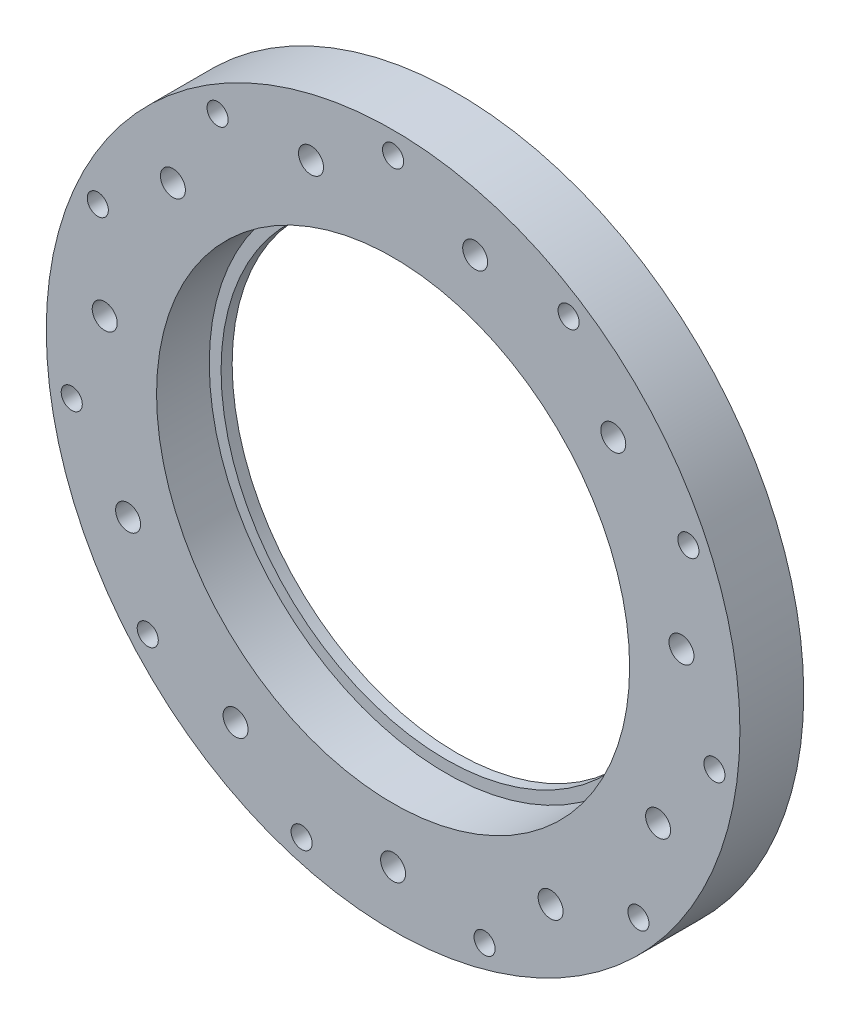
ISO-10303-21;
HEADER;
FILE_DESCRIPTION(('STEP AP214'),'2;1');
FILE_NAME('part.step','',(''),(''),'','','');
FILE_SCHEMA(('AUTOMOTIVE_DESIGN { 1 0 10303 214 1 1 1 1 }'));
ENDSEC;
DATA;
#1=APPLICATION_CONTEXT('core data for automotive mechanical design processes');
#2=APPLICATION_PROTOCOL_DEFINITION('international standard','automotive_design',2000,#1);
#3=PRODUCT_CONTEXT('',#1,'mechanical');
#4=PRODUCT('Part','Part','',(#3));
#5=PRODUCT_RELATED_PRODUCT_CATEGORY('part','',(#4));
#6=PRODUCT_DEFINITION_FORMATION('','',#4);
#7=PRODUCT_DEFINITION_CONTEXT('part definition',#1,'design');
#8=PRODUCT_DEFINITION('design','',#6,#7);
#9=PRODUCT_DEFINITION_SHAPE('','',#8);
#10=(LENGTH_UNIT() NAMED_UNIT(*) SI_UNIT(.MILLI.,.METRE.));
#11=(NAMED_UNIT(*) PLANE_ANGLE_UNIT() SI_UNIT($,.RADIAN.));
#12=(NAMED_UNIT(*) SI_UNIT($,.STERADIAN.) SOLID_ANGLE_UNIT());
#13=UNCERTAINTY_MEASURE_WITH_UNIT(LENGTH_MEASURE(1.E-05),#10,'distance_accuracy_value','');
#14=(GEOMETRIC_REPRESENTATION_CONTEXT(3) GLOBAL_UNCERTAINTY_ASSIGNED_CONTEXT((#13)) GLOBAL_UNIT_ASSIGNED_CONTEXT((#10,
#11,#12)) REPRESENTATION_CONTEXT('',''));
#15=CARTESIAN_POINT('',(0.,0.,0.));
#16=DIRECTION('',(0.,0.,1.));
#17=DIRECTION('',(1.,0.,0.));
#18=AXIS2_PLACEMENT_3D('',#15,#16,#17);
#19=CARTESIAN_POINT('',(0.,0.,11.5));
#20=DIRECTION('',(0.,0.,-1.));
#21=DIRECTION('',(-1.,0.,0.));
#22=AXIS2_PLACEMENT_3D('',#19,#20,#21);
#23=CYLINDRICAL_SURFACE('',#22,40.5);
#24=CARTESIAN_POINT('',(0.,0.,0.));
#25=DIRECTION('',(0.,0.,1.));
#26=DIRECTION('',(1.,0.,0.));
#27=AXIS2_PLACEMENT_3D('',#24,#25,#26);
#28=CIRCLE('',#27,40.5);
#29=CARTESIAN_POINT('',(40.5,0.,0.));
#30=VERTEX_POINT('',#29);
#31=EDGE_CURVE('E52',#30,#30,#28,.T.);
#32=ORIENTED_EDGE('',*,*,#31,.F.);
#33=EDGE_LOOP('',(#32));
#34=FACE_BOUND('',#33,.T.);
#35=CARTESIAN_POINT('',(0.,0.,2.));
#36=DIRECTION('',(0.,0.,1.));
#37=DIRECTION('',(1.,0.,0.));
#38=AXIS2_PLACEMENT_3D('',#35,#36,#37);
#39=CIRCLE('',#38,40.5);
#40=CARTESIAN_POINT('',(40.5,0.,2.));
#41=VERTEX_POINT('',#40);
#42=EDGE_CURVE('E41',#41,#41,#39,.T.);
#43=ORIENTED_EDGE('',*,*,#42,.T.);
#44=EDGE_LOOP('',(#43));
#45=FACE_BOUND('',#44,.T.);
#46=ADVANCED_FACE('F37',(#34,#45),#23,.F.);
#47=CARTESIAN_POINT('',(0.,0.,11.5));
#48=DIRECTION('',(0.,0.,1.));
#49=DIRECTION('',(1.,0.,0.));
#50=AXIS2_PLACEMENT_3D('',#47,#48,#49);
#51=PLANE('',#50);
#52=CARTESIAN_POINT('',(0.,0.,11.5));
#53=DIRECTION('',(0.,0.,1.));
#54=DIRECTION('',(1.,0.,0.));
#55=AXIS2_PLACEMENT_3D('',#52,#53,#54);
#56=CIRCLE('',#55,42.625);
#57=CARTESIAN_POINT('',(42.625,0.,11.5));
#58=VERTEX_POINT('',#57);
#59=EDGE_CURVE('E233',#58,#58,#56,.T.);
#60=ORIENTED_EDGE('',*,*,#59,.F.);
#61=EDGE_LOOP('',(#60));
#62=FACE_BOUND('',#61,.T.);
#63=CARTESIAN_POINT('',(16.481354575223,-56.1303389564483,11.5));
#64=DIRECTION('',(0.,0.,1.));
#65=DIRECTION('',(1.,0.,0.));
#66=AXIS2_PLACEMENT_3D('',#63,#64,#65);
#67=CIRCLE('',#66,1.9);
#68=CARTESIAN_POINT('',(18.381354575223,-56.1303389564483,11.5));
#69=VERTEX_POINT('',#68);
#70=EDGE_CURVE('E214',#69,#69,#67,.T.);
#71=ORIENTED_EDGE('',*,*,#70,.F.);
#72=EDGE_LOOP('',(#71));
#73=FACE_BOUND('',#72,.T.);
#74=CARTESIAN_POINT('',(57.9045543500346,-8.32541803898774,11.5));
#75=DIRECTION('',(0.,0.,1.));
#76=DIRECTION('',(1.,0.,0.));
#77=AXIS2_PLACEMENT_3D('',#74,#75,#76);
#78=CIRCLE('',#77,1.89999999999999);
#79=CARTESIAN_POINT('',(59.8045543500346,-8.32541803898774,11.5));
#80=VERTEX_POINT('',#79);
#81=EDGE_CURVE('E198',#80,#80,#78,.T.);
#82=ORIENTED_EDGE('',*,*,#81,.F.);
#83=EDGE_LOOP('',(#82));
#84=FACE_BOUND('',#83,.T.);
#85=CARTESIAN_POINT('',(31.6274878211535,49.2133316706235,11.5));
#86=DIRECTION('',(0.,0.,1.));
#87=DIRECTION('',(1.,0.,0.));
#88=AXIS2_PLACEMENT_3D('',#85,#86,#87);
#89=CIRCLE('',#88,1.90000000000001);
#90=CARTESIAN_POINT('',(33.5274878211535,49.2133316706235,11.5));
#91=VERTEX_POINT('',#90);
#92=EDGE_CURVE('E182',#91,#91,#89,.T.);
#93=ORIENTED_EDGE('',*,*,#92,.F.);
#94=EDGE_LOOP('',(#93));
#95=FACE_BOUND('',#94,.T.);
#96=CARTESIAN_POINT('',(-31.6274878211516,49.2133316706247,11.5));
#97=DIRECTION('',(0.,0.,1.));
#98=DIRECTION('',(1.,0.,0.));
#99=AXIS2_PLACEMENT_3D('',#96,#97,#98);
#100=CIRCLE('',#99,1.9);
#101=CARTESIAN_POINT('',(-29.7274878211516,49.2133316706247,11.5));
#102=VERTEX_POINT('',#101);
#103=EDGE_CURVE('E166',#102,#102,#100,.T.);
#104=ORIENTED_EDGE('',*,*,#103,.F.);
#105=EDGE_LOOP('',(#104));
#106=FACE_BOUND('',#105,.T.);
#107=CARTESIAN_POINT('',(-57.9045543500347,-8.3254180389863,11.5));
#108=DIRECTION('',(0.,0.,1.));
#109=DIRECTION('',(1.,0.,0.));
#110=AXIS2_PLACEMENT_3D('',#107,#108,#109);
#111=CIRCLE('',#110,1.9);
#112=CARTESIAN_POINT('',(-56.0045543500347,-8.3254180389863,11.5));
#113=VERTEX_POINT('',#112);
#114=EDGE_CURVE('E150',#113,#113,#111,.T.);
#115=ORIENTED_EDGE('',*,*,#114,.F.);
#116=EDGE_LOOP('',(#115));
#117=FACE_BOUND('',#116,.T.);
#118=CARTESIAN_POINT('',(28.3836429164183,-44.1658104736374,11.5));
#119=DIRECTION('',(0.,0.,1.));
#120=DIRECTION('',(1.,0.,0.));
#121=AXIS2_PLACEMENT_3D('',#118,#119,#120);
#122=CIRCLE('',#121,2.25000000000001);
#123=CARTESIAN_POINT('',(30.6336429164183,-44.1658104736374,11.5));
#124=VERTEX_POINT('',#123);
#125=EDGE_CURVE('E134',#124,#124,#122,.T.);
#126=ORIENTED_EDGE('',*,*,#125,.F.);
#127=EDGE_LOOP('',(#126));
#128=FACE_BOUND('',#127,.T.);
#129=CARTESIAN_POINT('',(51.965625698749,7.47152900934691,11.5));
#130=DIRECTION('',(0.,0.,1.));
#131=DIRECTION('',(1.,0.,0.));
#132=AXIS2_PLACEMENT_3D('',#129,#130,#131);
#133=CIRCLE('',#132,2.25);
#134=CARTESIAN_POINT('',(54.2156256987491,7.47152900934691,11.5));
#135=VERTEX_POINT('',#134);
#136=EDGE_CURVE('E118',#135,#135,#133,.T.);
#137=ORIENTED_EDGE('',*,*,#136,.F.);
#138=EDGE_LOOP('',(#137));
#139=FACE_BOUND('',#138,.T.);
#140=CARTESIAN_POINT('',(14.7909592341755,50.373381114761,11.5));
#141=DIRECTION('',(0.,0.,1.));
#142=DIRECTION('',(1.,0.,0.));
#143=AXIS2_PLACEMENT_3D('',#140,#141,#142);
#144=CIRCLE('',#143,2.25);
#145=CARTESIAN_POINT('',(17.0409592341755,50.373381114761,11.5));
#146=VERTEX_POINT('',#145);
#147=EDGE_CURVE('E102',#146,#146,#144,.T.);
#148=ORIENTED_EDGE('',*,*,#147,.F.);
#149=EDGE_LOOP('',(#148));
#150=FACE_BOUND('',#149,.T.);
#151=CARTESIAN_POINT('',(-39.6768526535979,34.3801885321282,11.5));
#152=DIRECTION('',(0.,0.,1.));
#153=DIRECTION('',(1.,0.,0.));
#154=AXIS2_PLACEMENT_3D('',#151,#152,#153);
#155=CIRCLE('',#154,2.25);
#156=CARTESIAN_POINT('',(-37.4268526535979,34.3801885321282,11.5));
#157=VERTEX_POINT('',#156);
#158=EDGE_CURVE('E86',#157,#157,#155,.T.);
#159=ORIENTED_EDGE('',*,*,#158,.F.);
#160=EDGE_LOOP('',(#159));
#161=FACE_BOUND('',#160,.T.);
#162=CARTESIAN_POINT('',(-47.7556797561126,-21.8092881825982,11.5));
#163=DIRECTION('',(0.,0.,1.));
#164=DIRECTION('',(1.,0.,0.));
#165=AXIS2_PLACEMENT_3D('',#162,#163,#164);
#166=CIRCLE('',#165,2.25);
#167=CARTESIAN_POINT('',(-45.5056797561126,-21.8092881825982,11.5));
#168=VERTEX_POINT('',#167);
#169=EDGE_CURVE('E70',#168,#168,#166,.T.);
#170=ORIENTED_EDGE('',*,*,#169,.F.);
#171=EDGE_LOOP('',(#170));
#172=FACE_BOUND('',#171,.T.);
#173=CARTESIAN_POINT('',(0.,-52.5,11.5));
#174=DIRECTION('',(0.,0.,1.));
#175=DIRECTION('',(1.,0.,0.));
#176=AXIS2_PLACEMENT_3D('',#173,#174,#175);
#177=CIRCLE('',#176,2.25);
#178=CARTESIAN_POINT('',(2.25,-52.5,11.5));
#179=VERTEX_POINT('',#178);
#180=EDGE_CURVE('E57',#179,#179,#177,.T.);
#181=ORIENTED_EDGE('',*,*,#180,.F.);
#182=EDGE_LOOP('',(#181));
#183=FACE_BOUND('',#182,.T.);
#184=CARTESIAN_POINT('',(0.,0.,11.5));
#185=DIRECTION('',(0.,0.,1.));
#186=DIRECTION('',(1.,0.,0.));
#187=AXIS2_PLACEMENT_3D('',#184,#185,#186);
#188=CIRCLE('',#187,62.5);
#189=CARTESIAN_POINT('',(62.5,0.,11.5));
#190=VERTEX_POINT('',#189);
#191=EDGE_CURVE('E10',#190,#190,#188,.T.);
#192=ORIENTED_EDGE('',*,*,#191,.T.);
#193=EDGE_LOOP('',(#192));
#194=FACE_BOUND('',#193,.T.);
#195=CARTESIAN_POINT('',(-28.3836429164196,-44.1658104736366,11.5));
#196=DIRECTION('',(0.,0.,1.));
#197=DIRECTION('',(1.,0.,0.));
#198=AXIS2_PLACEMENT_3D('',#195,#196,#197);
#199=CIRCLE('',#198,2.25);
#200=CARTESIAN_POINT('',(-26.1336429164196,-44.1658104736366,11.5));
#201=VERTEX_POINT('',#200);
#202=EDGE_CURVE('E62',#201,#201,#199,.T.);
#203=ORIENTED_EDGE('',*,*,#202,.F.);
#204=EDGE_LOOP('',(#203));
#205=FACE_BOUND('',#204,.T.);
#206=CARTESIAN_POINT('',(-51.9656256987488,7.4715290093484,11.5));
#207=DIRECTION('',(0.,0.,1.));
#208=DIRECTION('',(1.,0.,0.));
#209=AXIS2_PLACEMENT_3D('',#206,#207,#208);
#210=CIRCLE('',#209,2.25);
#211=CARTESIAN_POINT('',(-49.7156256987488,7.4715290093484,11.5));
#212=VERTEX_POINT('',#211);
#213=EDGE_CURVE('E78',#212,#212,#210,.T.);
#214=ORIENTED_EDGE('',*,*,#213,.F.);
#215=EDGE_LOOP('',(#214));
#216=FACE_BOUND('',#215,.T.);
#217=CARTESIAN_POINT('',(-14.790959234174,50.3733811147614,11.5));
#218=DIRECTION('',(0.,0.,1.));
#219=DIRECTION('',(1.,0.,0.));
#220=AXIS2_PLACEMENT_3D('',#217,#218,#219);
#221=CIRCLE('',#220,2.25);
#222=CARTESIAN_POINT('',(-12.540959234174,50.3733811147614,11.5));
#223=VERTEX_POINT('',#222);
#224=EDGE_CURVE('E94',#223,#223,#221,.T.);
#225=ORIENTED_EDGE('',*,*,#224,.F.);
#226=EDGE_LOOP('',(#225));
#227=FACE_BOUND('',#226,.T.);
#228=CARTESIAN_POINT('',(39.6768526535989,34.3801885321271,11.5));
#229=DIRECTION('',(0.,0.,1.));
#230=DIRECTION('',(1.,0.,0.));
#231=AXIS2_PLACEMENT_3D('',#228,#229,#230);
#232=CIRCLE('',#231,2.25);
#233=CARTESIAN_POINT('',(41.9268526535989,34.3801885321271,11.5));
#234=VERTEX_POINT('',#233);
#235=EDGE_CURVE('E110',#234,#234,#232,.T.);
#236=ORIENTED_EDGE('',*,*,#235,.F.);
#237=EDGE_LOOP('',(#236));
#238=FACE_BOUND('',#237,.T.);
#239=CARTESIAN_POINT('',(47.7556797561119,-21.8092881825996,11.5));
#240=DIRECTION('',(0.,0.,1.));
#241=DIRECTION('',(1.,0.,0.));
#242=AXIS2_PLACEMENT_3D('',#239,#240,#241);
#243=CIRCLE('',#242,2.25);
#244=CARTESIAN_POINT('',(50.0056797561119,-21.8092881825996,11.5));
#245=VERTEX_POINT('',#244);
#246=EDGE_CURVE('E126',#245,#245,#243,.T.);
#247=ORIENTED_EDGE('',*,*,#246,.F.);
#248=EDGE_LOOP('',(#247));
#249=FACE_BOUND('',#248,.T.);
#250=CARTESIAN_POINT('',(-44.2113500997241,-38.3093529357992,11.5));
#251=DIRECTION('',(0.,0.,1.));
#252=DIRECTION('',(1.,0.,0.));
#253=AXIS2_PLACEMENT_3D('',#250,#251,#252);
#254=CIRCLE('',#253,1.9);
#255=CARTESIAN_POINT('',(-42.3113500997241,-38.3093529357992,11.5));
#256=VERTEX_POINT('',#255);
#257=EDGE_CURVE('E142',#256,#256,#254,.T.);
#258=ORIENTED_EDGE('',*,*,#257,.F.);
#259=EDGE_LOOP('',(#258));
#260=FACE_BOUND('',#259,.T.);
#261=CARTESIAN_POINT('',(-53.2134717282389,24.3017782606113,11.5));
#262=DIRECTION('',(0.,0.,1.));
#263=DIRECTION('',(1.,0.,0.));
#264=AXIS2_PLACEMENT_3D('',#261,#262,#263);
#265=CIRCLE('',#264,1.9);
#266=CARTESIAN_POINT('',(-51.3134717282389,24.3017782606113,11.5));
#267=VERTEX_POINT('',#266);
#268=EDGE_CURVE('E158',#267,#267,#265,.T.);
#269=ORIENTED_EDGE('',*,*,#268,.F.);
#270=EDGE_LOOP('',(#269));
#271=FACE_BOUND('',#270,.T.);
#272=CARTESIAN_POINT('',(1.19522447494802E-12,58.5,11.5));
#273=DIRECTION('',(0.,0.,1.));
#274=DIRECTION('',(1.,0.,0.));
#275=AXIS2_PLACEMENT_3D('',#272,#273,#274);
#276=CIRCLE('',#275,1.9);
#277=CARTESIAN_POINT('',(1.90000000000119,58.5,11.5));
#278=VERTEX_POINT('',#277);
#279=EDGE_CURVE('E174',#278,#278,#276,.T.);
#280=ORIENTED_EDGE('',*,*,#279,.F.);
#281=EDGE_LOOP('',(#280));
#282=FACE_BOUND('',#281,.T.);
#283=CARTESIAN_POINT('',(53.2134717282399,24.3017782606092,11.5));
#284=DIRECTION('',(0.,0.,1.));
#285=DIRECTION('',(1.,0.,0.));
#286=AXIS2_PLACEMENT_3D('',#283,#284,#285);
#287=CIRCLE('',#286,1.9);
#288=CARTESIAN_POINT('',(55.1134717282399,24.3017782606092,11.5));
#289=VERTEX_POINT('',#288);
#290=EDGE_CURVE('E190',#289,#289,#287,.T.);
#291=ORIENTED_EDGE('',*,*,#290,.F.);
#292=EDGE_LOOP('',(#291));
#293=FACE_BOUND('',#292,.T.);
#294=CARTESIAN_POINT('',(44.2113500997238,-38.3093529357997,11.5));
#295=DIRECTION('',(0.,0.,1.));
#296=DIRECTION('',(1.,0.,0.));
#297=AXIS2_PLACEMENT_3D('',#294,#295,#296);
#298=CIRCLE('',#297,1.90000000000001);
#299=CARTESIAN_POINT('',(46.1113500997238,-38.3093529357997,11.5));
#300=VERTEX_POINT('',#299);
#301=EDGE_CURVE('E206',#300,#300,#298,.T.);
#302=ORIENTED_EDGE('',*,*,#301,.F.);
#303=EDGE_LOOP('',(#302));
#304=FACE_BOUND('',#303,.T.);
#305=CARTESIAN_POINT('',(-16.4813545752244,-56.1303389564479,11.5));
#306=DIRECTION('',(0.,0.,1.));
#307=DIRECTION('',(1.,0.,0.));
#308=AXIS2_PLACEMENT_3D('',#305,#306,#307);
#309=CIRCLE('',#308,1.89999999999999);
#310=CARTESIAN_POINT('',(-14.5813545752244,-56.1303389564479,11.5));
#311=VERTEX_POINT('',#310);
#312=EDGE_CURVE('E222',#311,#311,#309,.T.);
#313=ORIENTED_EDGE('',*,*,#312,.F.);
#314=EDGE_LOOP('',(#313));
#315=FACE_BOUND('',#314,.T.);
#316=ADVANCED_FACE('F258',(#62,#73,#84,#95,#106,#117,#128,#139,#150,#161,#172,#183,#194,#205,
#216,#227,#238,#249,#260,#271,#282,#293,#304,#315),#51,.T.);
#317=CARTESIAN_POINT('',(0.,0.,0.));
#318=DIRECTION('',(0.,0.,1.));
#319=DIRECTION('',(1.,0.,0.));
#320=AXIS2_PLACEMENT_3D('',#317,#318,#319);
#321=PLANE('',#320);
#322=CARTESIAN_POINT('',(0.,0.,0.));
#323=DIRECTION('',(0.,0.,1.));
#324=DIRECTION('',(1.,0.,0.));
#325=AXIS2_PLACEMENT_3D('',#322,#323,#324);
#326=CIRCLE('',#325,62.5);
#327=CARTESIAN_POINT('',(62.5,0.,0.));
#328=VERTEX_POINT('',#327);
#329=EDGE_CURVE('E46',#328,#328,#326,.T.);
#330=ORIENTED_EDGE('',*,*,#329,.F.);
#331=EDGE_LOOP('',(#330));
#332=FACE_BOUND('',#331,.T.);
#333=ORIENTED_EDGE('',*,*,#31,.T.);
#334=EDGE_LOOP('',(#333));
#335=FACE_BOUND('',#334,.T.);
#336=CARTESIAN_POINT('',(0.,-52.5,0.));
#337=DIRECTION('',(0.,0.,1.));
#338=DIRECTION('',(1.,0.,0.));
#339=AXIS2_PLACEMENT_3D('',#336,#337,#338);
#340=CIRCLE('',#339,2.25);
#341=CARTESIAN_POINT('',(2.25,-52.5,0.));
#342=VERTEX_POINT('',#341);
#343=EDGE_CURVE('E58',#342,#342,#340,.T.);
#344=ORIENTED_EDGE('',*,*,#343,.T.);
#345=EDGE_LOOP('',(#344));
#346=FACE_BOUND('',#345,.T.);
#347=CARTESIAN_POINT('',(-28.3836429164196,-44.1658104736366,0.));
#348=DIRECTION('',(0.,0.,1.));
#349=DIRECTION('',(1.,0.,0.));
#350=AXIS2_PLACEMENT_3D('',#347,#348,#349);
#351=CIRCLE('',#350,2.25);
#352=CARTESIAN_POINT('',(-26.1336429164196,-44.1658104736366,0.));
#353=VERTEX_POINT('',#352);
#354=EDGE_CURVE('E66',#353,#353,#351,.T.);
#355=ORIENTED_EDGE('',*,*,#354,.T.);
#356=EDGE_LOOP('',(#355));
#357=FACE_BOUND('',#356,.T.);
#358=CARTESIAN_POINT('',(-47.7556797561126,-21.8092881825982,0.));
#359=DIRECTION('',(0.,0.,1.));
#360=DIRECTION('',(1.,0.,0.));
#361=AXIS2_PLACEMENT_3D('',#358,#359,#360);
#362=CIRCLE('',#361,2.25);
#363=CARTESIAN_POINT('',(-45.5056797561126,-21.8092881825982,0.));
#364=VERTEX_POINT('',#363);
#365=EDGE_CURVE('E74',#364,#364,#362,.T.);
#366=ORIENTED_EDGE('',*,*,#365,.T.);
#367=EDGE_LOOP('',(#366));
#368=FACE_BOUND('',#367,.T.);
#369=CARTESIAN_POINT('',(-51.9656256987488,7.4715290093484,0.));
#370=DIRECTION('',(0.,0.,1.));
#371=DIRECTION('',(1.,0.,0.));
#372=AXIS2_PLACEMENT_3D('',#369,#370,#371);
#373=CIRCLE('',#372,2.25);
#374=CARTESIAN_POINT('',(-49.7156256987488,7.4715290093484,0.));
#375=VERTEX_POINT('',#374);
#376=EDGE_CURVE('E82',#375,#375,#373,.T.);
#377=ORIENTED_EDGE('',*,*,#376,.T.);
#378=EDGE_LOOP('',(#377));
#379=FACE_BOUND('',#378,.T.);
#380=CARTESIAN_POINT('',(-39.6768526535979,34.3801885321282,0.));
#381=DIRECTION('',(0.,0.,1.));
#382=DIRECTION('',(1.,0.,0.));
#383=AXIS2_PLACEMENT_3D('',#380,#381,#382);
#384=CIRCLE('',#383,2.25);
#385=CARTESIAN_POINT('',(-37.4268526535979,34.3801885321282,0.));
#386=VERTEX_POINT('',#385);
#387=EDGE_CURVE('E90',#386,#386,#384,.T.);
#388=ORIENTED_EDGE('',*,*,#387,.T.);
#389=EDGE_LOOP('',(#388));
#390=FACE_BOUND('',#389,.T.);
#391=CARTESIAN_POINT('',(-14.790959234174,50.3733811147614,0.));
#392=DIRECTION('',(0.,0.,1.));
#393=DIRECTION('',(1.,0.,0.));
#394=AXIS2_PLACEMENT_3D('',#391,#392,#393);
#395=CIRCLE('',#394,2.25);
#396=CARTESIAN_POINT('',(-12.540959234174,50.3733811147614,0.));
#397=VERTEX_POINT('',#396);
#398=EDGE_CURVE('E98',#397,#397,#395,.T.);
#399=ORIENTED_EDGE('',*,*,#398,.T.);
#400=EDGE_LOOP('',(#399));
#401=FACE_BOUND('',#400,.T.);
#402=CARTESIAN_POINT('',(14.7909592341755,50.373381114761,0.));
#403=DIRECTION('',(0.,0.,1.));
#404=DIRECTION('',(1.,0.,0.));
#405=AXIS2_PLACEMENT_3D('',#402,#403,#404);
#406=CIRCLE('',#405,2.25);
#407=CARTESIAN_POINT('',(17.0409592341755,50.373381114761,0.));
#408=VERTEX_POINT('',#407);
#409=EDGE_CURVE('E106',#408,#408,#406,.T.);
#410=ORIENTED_EDGE('',*,*,#409,.T.);
#411=EDGE_LOOP('',(#410));
#412=FACE_BOUND('',#411,.T.);
#413=CARTESIAN_POINT('',(39.6768526535989,34.3801885321271,0.));
#414=DIRECTION('',(0.,0.,1.));
#415=DIRECTION('',(1.,0.,0.));
#416=AXIS2_PLACEMENT_3D('',#413,#414,#415);
#417=CIRCLE('',#416,2.25);
#418=CARTESIAN_POINT('',(41.9268526535989,34.3801885321271,0.));
#419=VERTEX_POINT('',#418);
#420=EDGE_CURVE('E114',#419,#419,#417,.T.);
#421=ORIENTED_EDGE('',*,*,#420,.T.);
#422=EDGE_LOOP('',(#421));
#423=FACE_BOUND('',#422,.T.);
#424=CARTESIAN_POINT('',(51.965625698749,7.47152900934691,0.));
#425=DIRECTION('',(0.,0.,1.));
#426=DIRECTION('',(1.,0.,0.));
#427=AXIS2_PLACEMENT_3D('',#424,#425,#426);
#428=CIRCLE('',#427,2.25);
#429=CARTESIAN_POINT('',(54.2156256987491,7.47152900934691,0.));
#430=VERTEX_POINT('',#429);
#431=EDGE_CURVE('E122',#430,#430,#428,.T.);
#432=ORIENTED_EDGE('',*,*,#431,.T.);
#433=EDGE_LOOP('',(#432));
#434=FACE_BOUND('',#433,.T.);
#435=CARTESIAN_POINT('',(47.7556797561119,-21.8092881825996,0.));
#436=DIRECTION('',(0.,0.,1.));
#437=DIRECTION('',(1.,0.,0.));
#438=AXIS2_PLACEMENT_3D('',#435,#436,#437);
#439=CIRCLE('',#438,2.25);
#440=CARTESIAN_POINT('',(50.0056797561119,-21.8092881825996,0.));
#441=VERTEX_POINT('',#440);
#442=EDGE_CURVE('E130',#441,#441,#439,.T.);
#443=ORIENTED_EDGE('',*,*,#442,.T.);
#444=EDGE_LOOP('',(#443));
#445=FACE_BOUND('',#444,.T.);
#446=CARTESIAN_POINT('',(28.3836429164183,-44.1658104736374,0.));
#447=DIRECTION('',(0.,0.,1.));
#448=DIRECTION('',(1.,0.,0.));
#449=AXIS2_PLACEMENT_3D('',#446,#447,#448);
#450=CIRCLE('',#449,2.25000000000001);
#451=CARTESIAN_POINT('',(30.6336429164183,-44.1658104736374,0.));
#452=VERTEX_POINT('',#451);
#453=EDGE_CURVE('E138',#452,#452,#450,.T.);
#454=ORIENTED_EDGE('',*,*,#453,.T.);
#455=EDGE_LOOP('',(#454));
#456=FACE_BOUND('',#455,.T.);
#457=CARTESIAN_POINT('',(-44.2113500997241,-38.3093529357992,0.));
#458=DIRECTION('',(0.,0.,1.));
#459=DIRECTION('',(1.,0.,0.));
#460=AXIS2_PLACEMENT_3D('',#457,#458,#459);
#461=CIRCLE('',#460,1.9);
#462=CARTESIAN_POINT('',(-42.3113500997241,-38.3093529357992,0.));
#463=VERTEX_POINT('',#462);
#464=EDGE_CURVE('E146',#463,#463,#461,.T.);
#465=ORIENTED_EDGE('',*,*,#464,.T.);
#466=EDGE_LOOP('',(#465));
#467=FACE_BOUND('',#466,.T.);
#468=CARTESIAN_POINT('',(-57.9045543500347,-8.3254180389863,0.));
#469=DIRECTION('',(0.,0.,1.));
#470=DIRECTION('',(1.,0.,0.));
#471=AXIS2_PLACEMENT_3D('',#468,#469,#470);
#472=CIRCLE('',#471,1.9);
#473=CARTESIAN_POINT('',(-56.0045543500347,-8.3254180389863,0.));
#474=VERTEX_POINT('',#473);
#475=EDGE_CURVE('E154',#474,#474,#472,.T.);
#476=ORIENTED_EDGE('',*,*,#475,.T.);
#477=EDGE_LOOP('',(#476));
#478=FACE_BOUND('',#477,.T.);
#479=CARTESIAN_POINT('',(-53.2134717282389,24.3017782606113,0.));
#480=DIRECTION('',(0.,0.,1.));
#481=DIRECTION('',(1.,0.,0.));
#482=AXIS2_PLACEMENT_3D('',#479,#480,#481);
#483=CIRCLE('',#482,1.9);
#484=CARTESIAN_POINT('',(-51.3134717282389,24.3017782606113,0.));
#485=VERTEX_POINT('',#484);
#486=EDGE_CURVE('E162',#485,#485,#483,.T.);
#487=ORIENTED_EDGE('',*,*,#486,.T.);
#488=EDGE_LOOP('',(#487));
#489=FACE_BOUND('',#488,.T.);
#490=CARTESIAN_POINT('',(-31.6274878211516,49.2133316706247,0.));
#491=DIRECTION('',(0.,0.,1.));
#492=DIRECTION('',(1.,0.,0.));
#493=AXIS2_PLACEMENT_3D('',#490,#491,#492);
#494=CIRCLE('',#493,1.9);
#495=CARTESIAN_POINT('',(-29.7274878211516,49.2133316706247,0.));
#496=VERTEX_POINT('',#495);
#497=EDGE_CURVE('E170',#496,#496,#494,.T.);
#498=ORIENTED_EDGE('',*,*,#497,.T.);
#499=EDGE_LOOP('',(#498));
#500=FACE_BOUND('',#499,.T.);
#501=CARTESIAN_POINT('',(1.19522447494802E-12,58.5,0.));
#502=DIRECTION('',(0.,0.,1.));
#503=DIRECTION('',(1.,0.,0.));
#504=AXIS2_PLACEMENT_3D('',#501,#502,#503);
#505=CIRCLE('',#504,1.9);
#506=CARTESIAN_POINT('',(1.90000000000119,58.5,0.));
#507=VERTEX_POINT('',#506);
#508=EDGE_CURVE('E178',#507,#507,#505,.T.);
#509=ORIENTED_EDGE('',*,*,#508,.T.);
#510=EDGE_LOOP('',(#509));
#511=FACE_BOUND('',#510,.T.);
#512=CARTESIAN_POINT('',(31.6274878211535,49.2133316706235,0.));
#513=DIRECTION('',(0.,0.,1.));
#514=DIRECTION('',(1.,0.,0.));
#515=AXIS2_PLACEMENT_3D('',#512,#513,#514);
#516=CIRCLE('',#515,1.90000000000001);
#517=CARTESIAN_POINT('',(33.5274878211535,49.2133316706235,0.));
#518=VERTEX_POINT('',#517);
#519=EDGE_CURVE('E186',#518,#518,#516,.T.);
#520=ORIENTED_EDGE('',*,*,#519,.T.);
#521=EDGE_LOOP('',(#520));
#522=FACE_BOUND('',#521,.T.);
#523=CARTESIAN_POINT('',(53.2134717282399,24.3017782606092,0.));
#524=DIRECTION('',(0.,0.,1.));
#525=DIRECTION('',(1.,0.,0.));
#526=AXIS2_PLACEMENT_3D('',#523,#524,#525);
#527=CIRCLE('',#526,1.9);
#528=CARTESIAN_POINT('',(55.1134717282399,24.3017782606092,0.));
#529=VERTEX_POINT('',#528);
#530=EDGE_CURVE('E194',#529,#529,#527,.T.);
#531=ORIENTED_EDGE('',*,*,#530,.T.);
#532=EDGE_LOOP('',(#531));
#533=FACE_BOUND('',#532,.T.);
#534=CARTESIAN_POINT('',(57.9045543500346,-8.32541803898774,0.));
#535=DIRECTION('',(0.,0.,1.));
#536=DIRECTION('',(1.,0.,0.));
#537=AXIS2_PLACEMENT_3D('',#534,#535,#536);
#538=CIRCLE('',#537,1.89999999999999);
#539=CARTESIAN_POINT('',(59.8045543500346,-8.32541803898774,0.));
#540=VERTEX_POINT('',#539);
#541=EDGE_CURVE('E202',#540,#540,#538,.T.);
#542=ORIENTED_EDGE('',*,*,#541,.T.);
#543=EDGE_LOOP('',(#542));
#544=FACE_BOUND('',#543,.T.);
#545=CARTESIAN_POINT('',(44.2113500997238,-38.3093529357997,0.));
#546=DIRECTION('',(0.,0.,1.));
#547=DIRECTION('',(1.,0.,0.));
#548=AXIS2_PLACEMENT_3D('',#545,#546,#547);
#549=CIRCLE('',#548,1.90000000000001);
#550=CARTESIAN_POINT('',(46.1113500997238,-38.3093529357997,0.));
#551=VERTEX_POINT('',#550);
#552=EDGE_CURVE('E210',#551,#551,#549,.T.);
#553=ORIENTED_EDGE('',*,*,#552,.T.);
#554=EDGE_LOOP('',(#553));
#555=FACE_BOUND('',#554,.T.);
#556=CARTESIAN_POINT('',(16.481354575223,-56.1303389564483,0.));
#557=DIRECTION('',(0.,0.,1.));
#558=DIRECTION('',(1.,0.,0.));
#559=AXIS2_PLACEMENT_3D('',#556,#557,#558);
#560=CIRCLE('',#559,1.9);
#561=CARTESIAN_POINT('',(18.381354575223,-56.1303389564483,0.));
#562=VERTEX_POINT('',#561);
#563=EDGE_CURVE('E218',#562,#562,#560,.T.);
#564=ORIENTED_EDGE('',*,*,#563,.T.);
#565=EDGE_LOOP('',(#564));
#566=FACE_BOUND('',#565,.T.);
#567=CARTESIAN_POINT('',(-16.4813545752244,-56.1303389564479,0.));
#568=DIRECTION('',(0.,0.,1.));
#569=DIRECTION('',(1.,0.,0.));
#570=AXIS2_PLACEMENT_3D('',#567,#568,#569);
#571=CIRCLE('',#570,1.89999999999999);
#572=CARTESIAN_POINT('',(-14.5813545752244,-56.1303389564479,0.));
#573=VERTEX_POINT('',#572);
#574=EDGE_CURVE('E226',#573,#573,#571,.T.);
#575=ORIENTED_EDGE('',*,*,#574,.T.);
#576=EDGE_LOOP('',(#575));
#577=FACE_BOUND('',#576,.T.);
#578=ADVANCED_FACE('F264',(#332,#335,#346,#357,#368,#379,#390,#401,#412,#423,#434,#445,#456,
#467,#478,#489,#500,#511,#522,#533,#544,#555,#566,#577),#321,.F.);
#579=CARTESIAN_POINT('',(0.,0.,11.5));
#580=DIRECTION('',(0.,0.,-1.));
#581=DIRECTION('',(-1.,0.,0.));
#582=AXIS2_PLACEMENT_3D('',#579,#580,#581);
#583=CYLINDRICAL_SURFACE('',#582,62.5);
#584=ORIENTED_EDGE('',*,*,#191,.F.);
#585=EDGE_LOOP('',(#584));
#586=FACE_BOUND('',#585,.T.);
#587=ORIENTED_EDGE('',*,*,#329,.T.);
#588=EDGE_LOOP('',(#587));
#589=FACE_BOUND('',#588,.T.);
#590=ADVANCED_FACE('F39',(#586,#589),#583,.T.);
#591=CARTESIAN_POINT('',(0.,-52.5,11.5));
#592=DIRECTION('',(0.,0.,-1.));
#593=DIRECTION('',(-1.,0.,0.));
#594=AXIS2_PLACEMENT_3D('',#591,#592,#593);
#595=CYLINDRICAL_SURFACE('',#594,2.25);
#596=ORIENTED_EDGE('',*,*,#180,.T.);
#597=EDGE_LOOP('',(#596));
#598=FACE_BOUND('',#597,.T.);
#599=ORIENTED_EDGE('',*,*,#343,.F.);
#600=EDGE_LOOP('',(#599));
#601=FACE_BOUND('',#600,.T.);
#602=ADVANCED_FACE('F269',(#598,#601),#595,.F.);
#603=CARTESIAN_POINT('',(-28.3836429164196,-44.1658104736366,11.5));
#604=DIRECTION('',(0.,0.,-1.));
#605=DIRECTION('',(-1.,0.,0.));
#606=AXIS2_PLACEMENT_3D('',#603,#604,#605);
#607=CYLINDRICAL_SURFACE('',#606,2.25);
#608=ORIENTED_EDGE('',*,*,#202,.T.);
#609=EDGE_LOOP('',(#608));
#610=FACE_BOUND('',#609,.T.);
#611=ORIENTED_EDGE('',*,*,#354,.F.);
#612=EDGE_LOOP('',(#611));
#613=FACE_BOUND('',#612,.T.);
#614=ADVANCED_FACE('F404',(#610,#613),#607,.F.);
#615=CARTESIAN_POINT('',(-47.7556797561126,-21.8092881825982,11.5));
#616=DIRECTION('',(0.,0.,-1.));
#617=DIRECTION('',(-1.,0.,0.));
#618=AXIS2_PLACEMENT_3D('',#615,#616,#617);
#619=CYLINDRICAL_SURFACE('',#618,2.25);
#620=ORIENTED_EDGE('',*,*,#169,.T.);
#621=EDGE_LOOP('',(#620));
#622=FACE_BOUND('',#621,.T.);
#623=ORIENTED_EDGE('',*,*,#365,.F.);
#624=EDGE_LOOP('',(#623));
#625=FACE_BOUND('',#624,.T.);
#626=ADVANCED_FACE('F401',(#622,#625),#619,.F.);
#627=CARTESIAN_POINT('',(-51.9656256987488,7.4715290093484,11.5));
#628=DIRECTION('',(0.,0.,-1.));
#629=DIRECTION('',(-1.,0.,0.));
#630=AXIS2_PLACEMENT_3D('',#627,#628,#629);
#631=CYLINDRICAL_SURFACE('',#630,2.25);
#632=ORIENTED_EDGE('',*,*,#213,.T.);
#633=EDGE_LOOP('',(#632));
#634=FACE_BOUND('',#633,.T.);
#635=ORIENTED_EDGE('',*,*,#376,.F.);
#636=EDGE_LOOP('',(#635));
#637=FACE_BOUND('',#636,.T.);
#638=ADVANCED_FACE('F397',(#634,#637),#631,.F.);
#639=CARTESIAN_POINT('',(-39.6768526535979,34.3801885321282,11.5));
#640=DIRECTION('',(0.,0.,-1.));
#641=DIRECTION('',(-1.,0.,0.));
#642=AXIS2_PLACEMENT_3D('',#639,#640,#641);
#643=CYLINDRICAL_SURFACE('',#642,2.25);
#644=ORIENTED_EDGE('',*,*,#158,.T.);
#645=EDGE_LOOP('',(#644));
#646=FACE_BOUND('',#645,.T.);
#647=ORIENTED_EDGE('',*,*,#387,.F.);
#648=EDGE_LOOP('',(#647));
#649=FACE_BOUND('',#648,.T.);
#650=ADVANCED_FACE('F393',(#646,#649),#643,.F.);
#651=CARTESIAN_POINT('',(-14.790959234174,50.3733811147614,11.5));
#652=DIRECTION('',(0.,0.,-1.));
#653=DIRECTION('',(-1.,0.,0.));
#654=AXIS2_PLACEMENT_3D('',#651,#652,#653);
#655=CYLINDRICAL_SURFACE('',#654,2.25);
#656=ORIENTED_EDGE('',*,*,#224,.T.);
#657=EDGE_LOOP('',(#656));
#658=FACE_BOUND('',#657,.T.);
#659=ORIENTED_EDGE('',*,*,#398,.F.);
#660=EDGE_LOOP('',(#659));
#661=FACE_BOUND('',#660,.T.);
#662=ADVANCED_FACE('F389',(#658,#661),#655,.F.);
#663=CARTESIAN_POINT('',(14.7909592341755,50.373381114761,11.5));
#664=DIRECTION('',(0.,0.,-1.));
#665=DIRECTION('',(-1.,0.,0.));
#666=AXIS2_PLACEMENT_3D('',#663,#664,#665);
#667=CYLINDRICAL_SURFACE('',#666,2.25);
#668=ORIENTED_EDGE('',*,*,#147,.T.);
#669=EDGE_LOOP('',(#668));
#670=FACE_BOUND('',#669,.T.);
#671=ORIENTED_EDGE('',*,*,#409,.F.);
#672=EDGE_LOOP('',(#671));
#673=FACE_BOUND('',#672,.T.);
#674=ADVANCED_FACE('F385',(#670,#673),#667,.F.);
#675=CARTESIAN_POINT('',(39.6768526535989,34.3801885321271,11.5));
#676=DIRECTION('',(0.,0.,-1.));
#677=DIRECTION('',(-1.,0.,0.));
#678=AXIS2_PLACEMENT_3D('',#675,#676,#677);
#679=CYLINDRICAL_SURFACE('',#678,2.25);
#680=ORIENTED_EDGE('',*,*,#235,.T.);
#681=EDGE_LOOP('',(#680));
#682=FACE_BOUND('',#681,.T.);
#683=ORIENTED_EDGE('',*,*,#420,.F.);
#684=EDGE_LOOP('',(#683));
#685=FACE_BOUND('',#684,.T.);
#686=ADVANCED_FACE('F381',(#682,#685),#679,.F.);
#687=CARTESIAN_POINT('',(51.965625698749,7.47152900934691,11.5));
#688=DIRECTION('',(0.,0.,-1.));
#689=DIRECTION('',(-1.,0.,0.));
#690=AXIS2_PLACEMENT_3D('',#687,#688,#689);
#691=CYLINDRICAL_SURFACE('',#690,2.25);
#692=ORIENTED_EDGE('',*,*,#136,.T.);
#693=EDGE_LOOP('',(#692));
#694=FACE_BOUND('',#693,.T.);
#695=ORIENTED_EDGE('',*,*,#431,.F.);
#696=EDGE_LOOP('',(#695));
#697=FACE_BOUND('',#696,.T.);
#698=ADVANCED_FACE('F377',(#694,#697),#691,.F.);
#699=CARTESIAN_POINT('',(47.7556797561119,-21.8092881825996,11.5));
#700=DIRECTION('',(0.,0.,-1.));
#701=DIRECTION('',(-1.,0.,0.));
#702=AXIS2_PLACEMENT_3D('',#699,#700,#701);
#703=CYLINDRICAL_SURFACE('',#702,2.25);
#704=ORIENTED_EDGE('',*,*,#246,.T.);
#705=EDGE_LOOP('',(#704));
#706=FACE_BOUND('',#705,.T.);
#707=ORIENTED_EDGE('',*,*,#442,.F.);
#708=EDGE_LOOP('',(#707));
#709=FACE_BOUND('',#708,.T.);
#710=ADVANCED_FACE('F373',(#706,#709),#703,.F.);
#711=CARTESIAN_POINT('',(28.3836429164183,-44.1658104736374,11.5));
#712=DIRECTION('',(0.,0.,-1.));
#713=DIRECTION('',(-1.,0.,0.));
#714=AXIS2_PLACEMENT_3D('',#711,#712,#713);
#715=CYLINDRICAL_SURFACE('',#714,2.25000000000001);
#716=ORIENTED_EDGE('',*,*,#125,.T.);
#717=EDGE_LOOP('',(#716));
#718=FACE_BOUND('',#717,.T.);
#719=ORIENTED_EDGE('',*,*,#453,.F.);
#720=EDGE_LOOP('',(#719));
#721=FACE_BOUND('',#720,.T.);
#722=ADVANCED_FACE('F369',(#718,#721),#715,.F.);
#723=CARTESIAN_POINT('',(-44.2113500997241,-38.3093529357992,11.5));
#724=DIRECTION('',(0.,0.,-1.));
#725=DIRECTION('',(-1.,0.,0.));
#726=AXIS2_PLACEMENT_3D('',#723,#724,#725);
#727=CYLINDRICAL_SURFACE('',#726,1.9);
#728=ORIENTED_EDGE('',*,*,#257,.T.);
#729=EDGE_LOOP('',(#728));
#730=FACE_BOUND('',#729,.T.);
#731=ORIENTED_EDGE('',*,*,#464,.F.);
#732=EDGE_LOOP('',(#731));
#733=FACE_BOUND('',#732,.T.);
#734=ADVANCED_FACE('F365',(#730,#733),#727,.F.);
#735=CARTESIAN_POINT('',(-57.9045543500347,-8.3254180389863,11.5));
#736=DIRECTION('',(0.,0.,-1.));
#737=DIRECTION('',(-1.,0.,0.));
#738=AXIS2_PLACEMENT_3D('',#735,#736,#737);
#739=CYLINDRICAL_SURFACE('',#738,1.9);
#740=ORIENTED_EDGE('',*,*,#114,.T.);
#741=EDGE_LOOP('',(#740));
#742=FACE_BOUND('',#741,.T.);
#743=ORIENTED_EDGE('',*,*,#475,.F.);
#744=EDGE_LOOP('',(#743));
#745=FACE_BOUND('',#744,.T.);
#746=ADVANCED_FACE('F361',(#742,#745),#739,.F.);
#747=CARTESIAN_POINT('',(-53.2134717282389,24.3017782606113,11.5));
#748=DIRECTION('',(0.,0.,-1.));
#749=DIRECTION('',(-1.,0.,0.));
#750=AXIS2_PLACEMENT_3D('',#747,#748,#749);
#751=CYLINDRICAL_SURFACE('',#750,1.9);
#752=ORIENTED_EDGE('',*,*,#268,.T.);
#753=EDGE_LOOP('',(#752));
#754=FACE_BOUND('',#753,.T.);
#755=ORIENTED_EDGE('',*,*,#486,.F.);
#756=EDGE_LOOP('',(#755));
#757=FACE_BOUND('',#756,.T.);
#758=ADVANCED_FACE('F357',(#754,#757),#751,.F.);
#759=CARTESIAN_POINT('',(-31.6274878211516,49.2133316706247,11.5));
#760=DIRECTION('',(0.,0.,-1.));
#761=DIRECTION('',(-1.,0.,0.));
#762=AXIS2_PLACEMENT_3D('',#759,#760,#761);
#763=CYLINDRICAL_SURFACE('',#762,1.9);
#764=ORIENTED_EDGE('',*,*,#103,.T.);
#765=EDGE_LOOP('',(#764));
#766=FACE_BOUND('',#765,.T.);
#767=ORIENTED_EDGE('',*,*,#497,.F.);
#768=EDGE_LOOP('',(#767));
#769=FACE_BOUND('',#768,.T.);
#770=ADVANCED_FACE('F353',(#766,#769),#763,.F.);
#771=CARTESIAN_POINT('',(1.19522447494802E-12,58.5,11.5));
#772=DIRECTION('',(0.,0.,-1.));
#773=DIRECTION('',(-1.,0.,0.));
#774=AXIS2_PLACEMENT_3D('',#771,#772,#773);
#775=CYLINDRICAL_SURFACE('',#774,1.9);
#776=ORIENTED_EDGE('',*,*,#279,.T.);
#777=EDGE_LOOP('',(#776));
#778=FACE_BOUND('',#777,.T.);
#779=ORIENTED_EDGE('',*,*,#508,.F.);
#780=EDGE_LOOP('',(#779));
#781=FACE_BOUND('',#780,.T.);
#782=ADVANCED_FACE('F349',(#778,#781),#775,.F.);
#783=CARTESIAN_POINT('',(31.6274878211535,49.2133316706235,11.5));
#784=DIRECTION('',(0.,0.,-1.));
#785=DIRECTION('',(-1.,0.,0.));
#786=AXIS2_PLACEMENT_3D('',#783,#784,#785);
#787=CYLINDRICAL_SURFACE('',#786,1.90000000000001);
#788=ORIENTED_EDGE('',*,*,#92,.T.);
#789=EDGE_LOOP('',(#788));
#790=FACE_BOUND('',#789,.T.);
#791=ORIENTED_EDGE('',*,*,#519,.F.);
#792=EDGE_LOOP('',(#791));
#793=FACE_BOUND('',#792,.T.);
#794=ADVANCED_FACE('F345',(#790,#793),#787,.F.);
#795=CARTESIAN_POINT('',(53.2134717282399,24.3017782606092,11.5));
#796=DIRECTION('',(0.,0.,-1.));
#797=DIRECTION('',(-1.,0.,0.));
#798=AXIS2_PLACEMENT_3D('',#795,#796,#797);
#799=CYLINDRICAL_SURFACE('',#798,1.9);
#800=ORIENTED_EDGE('',*,*,#290,.T.);
#801=EDGE_LOOP('',(#800));
#802=FACE_BOUND('',#801,.T.);
#803=ORIENTED_EDGE('',*,*,#530,.F.);
#804=EDGE_LOOP('',(#803));
#805=FACE_BOUND('',#804,.T.);
#806=ADVANCED_FACE('F341',(#802,#805),#799,.F.);
#807=CARTESIAN_POINT('',(57.9045543500346,-8.32541803898774,11.5));
#808=DIRECTION('',(0.,0.,-1.));
#809=DIRECTION('',(-1.,0.,0.));
#810=AXIS2_PLACEMENT_3D('',#807,#808,#809);
#811=CYLINDRICAL_SURFACE('',#810,1.89999999999999);
#812=ORIENTED_EDGE('',*,*,#81,.T.);
#813=EDGE_LOOP('',(#812));
#814=FACE_BOUND('',#813,.T.);
#815=ORIENTED_EDGE('',*,*,#541,.F.);
#816=EDGE_LOOP('',(#815));
#817=FACE_BOUND('',#816,.T.);
#818=ADVANCED_FACE('F337',(#814,#817),#811,.F.);
#819=CARTESIAN_POINT('',(44.2113500997238,-38.3093529357997,11.5));
#820=DIRECTION('',(0.,0.,-1.));
#821=DIRECTION('',(-1.,0.,0.));
#822=AXIS2_PLACEMENT_3D('',#819,#820,#821);
#823=CYLINDRICAL_SURFACE('',#822,1.90000000000001);
#824=ORIENTED_EDGE('',*,*,#301,.T.);
#825=EDGE_LOOP('',(#824));
#826=FACE_BOUND('',#825,.T.);
#827=ORIENTED_EDGE('',*,*,#552,.F.);
#828=EDGE_LOOP('',(#827));
#829=FACE_BOUND('',#828,.T.);
#830=ADVANCED_FACE('F331',(#826,#829),#823,.F.);
#831=CARTESIAN_POINT('',(16.481354575223,-56.1303389564483,11.5));
#832=DIRECTION('',(0.,0.,-1.));
#833=DIRECTION('',(-1.,0.,0.));
#834=AXIS2_PLACEMENT_3D('',#831,#832,#833);
#835=CYLINDRICAL_SURFACE('',#834,1.9);
#836=ORIENTED_EDGE('',*,*,#70,.T.);
#837=EDGE_LOOP('',(#836));
#838=FACE_BOUND('',#837,.T.);
#839=ORIENTED_EDGE('',*,*,#563,.F.);
#840=EDGE_LOOP('',(#839));
#841=FACE_BOUND('',#840,.T.);
#842=ADVANCED_FACE('F325',(#838,#841),#835,.F.);
#843=CARTESIAN_POINT('',(-16.4813545752244,-56.1303389564479,11.5));
#844=DIRECTION('',(0.,0.,-1.));
#845=DIRECTION('',(-1.,0.,0.));
#846=AXIS2_PLACEMENT_3D('',#843,#844,#845);
#847=CYLINDRICAL_SURFACE('',#846,1.89999999999999);
#848=ORIENTED_EDGE('',*,*,#312,.T.);
#849=EDGE_LOOP('',(#848));
#850=FACE_BOUND('',#849,.T.);
#851=ORIENTED_EDGE('',*,*,#574,.F.);
#852=EDGE_LOOP('',(#851));
#853=FACE_BOUND('',#852,.T.);
#854=ADVANCED_FACE('F254',(#850,#853),#847,.F.);
#855=CARTESIAN_POINT('',(0.,0.,2.));
#856=DIRECTION('',(0.,0.,1.));
#857=DIRECTION('',(1.,0.,0.));
#858=AXIS2_PLACEMENT_3D('',#855,#856,#857);
#859=CYLINDRICAL_SURFACE('',#858,42.625);
#860=CARTESIAN_POINT('',(0.,0.,2.));
#861=DIRECTION('',(0.,0.,1.));
#862=DIRECTION('',(1.,0.,0.));
#863=AXIS2_PLACEMENT_3D('',#860,#861,#862);
#864=CIRCLE('',#863,42.625);
#865=CARTESIAN_POINT('',(42.625,0.,2.));
#866=VERTEX_POINT('',#865);
#867=EDGE_CURVE('E237',#866,#866,#864,.T.);
#868=ORIENTED_EDGE('',*,*,#867,.F.);
#869=EDGE_LOOP('',(#868));
#870=FACE_BOUND('',#869,.T.);
#871=ORIENTED_EDGE('',*,*,#59,.T.);
#872=EDGE_LOOP('',(#871));
#873=FACE_BOUND('',#872,.T.);
#874=ADVANCED_FACE('F249',(#870,#873),#859,.F.);
#875=CARTESIAN_POINT('',(0.,0.,2.));
#876=DIRECTION('',(0.,0.,1.));
#877=DIRECTION('',(1.,0.,0.));
#878=AXIS2_PLACEMENT_3D('',#875,#876,#877);
#879=PLANE('',#878);
#880=ORIENTED_EDGE('',*,*,#42,.F.);
#881=EDGE_LOOP('',(#880));
#882=FACE_BOUND('',#881,.T.);
#883=ORIENTED_EDGE('',*,*,#867,.T.);
#884=EDGE_LOOP('',(#883));
#885=FACE_BOUND('',#884,.T.);
#886=ADVANCED_FACE('F247',(#882,#885),#879,.T.);
#887=CLOSED_SHELL('',(#46,#316,#578,#590,#602,#614,#626,#638,#650,#662,#674,#686,#698,#710,#722,
#734,#746,#758,#770,#782,#794,#806,#818,#830,#842,#854,#874,#886));
#888=MANIFOLD_SOLID_BREP('B2',#887);
#889=ADVANCED_BREP_SHAPE_REPRESENTATION('',(#18,#888),#14);
#890=SHAPE_DEFINITION_REPRESENTATION(#9,#889);
ENDSEC;
END-ISO-10303-21;
